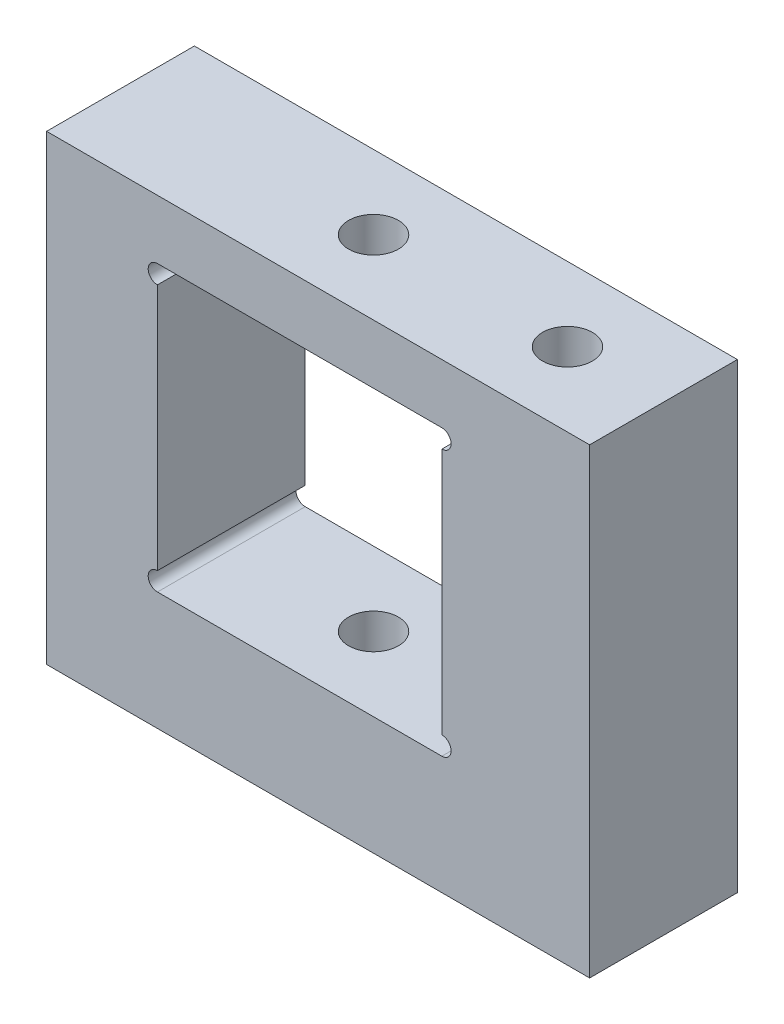
ISO-10303-21;
HEADER;
FILE_DESCRIPTION(('STEP AP214'),'2;1');
FILE_NAME('part.step','',(''),(''),'','','');
FILE_SCHEMA(('AUTOMOTIVE_DESIGN { 1 0 10303 214 1 1 1 1 }'));
ENDSEC;
DATA;
#1=APPLICATION_CONTEXT('core data for automotive mechanical design processes');
#2=APPLICATION_PROTOCOL_DEFINITION('international standard','automotive_design',2000,#1);
#3=PRODUCT_CONTEXT('',#1,'mechanical');
#4=PRODUCT('Part','Part','',(#3));
#5=PRODUCT_RELATED_PRODUCT_CATEGORY('part','',(#4));
#6=PRODUCT_DEFINITION_FORMATION('','',#4);
#7=PRODUCT_DEFINITION_CONTEXT('part definition',#1,'design');
#8=PRODUCT_DEFINITION('design','',#6,#7);
#9=PRODUCT_DEFINITION_SHAPE('','',#8);
#10=(LENGTH_UNIT() NAMED_UNIT(*) SI_UNIT(.MILLI.,.METRE.));
#11=(NAMED_UNIT(*) PLANE_ANGLE_UNIT() SI_UNIT($,.RADIAN.));
#12=(NAMED_UNIT(*) SI_UNIT($,.STERADIAN.) SOLID_ANGLE_UNIT());
#13=UNCERTAINTY_MEASURE_WITH_UNIT(LENGTH_MEASURE(1.E-05),#10,'distance_accuracy_value','');
#14=(GEOMETRIC_REPRESENTATION_CONTEXT(3) GLOBAL_UNCERTAINTY_ASSIGNED_CONTEXT((#13)) GLOBAL_UNIT_ASSIGNED_CONTEXT((#10,
#11,#12)) REPRESENTATION_CONTEXT('',''));
#15=CARTESIAN_POINT('',(0.,0.,0.));
#16=DIRECTION('',(0.,0.,1.));
#17=DIRECTION('',(1.,0.,0.));
#18=AXIS2_PLACEMENT_3D('',#15,#16,#17);
#19=CARTESIAN_POINT('',(-13.7,0.,8.));
#20=DIRECTION('',(-1.,0.,0.));
#21=DIRECTION('',(0.,0.,1.));
#22=AXIS2_PLACEMENT_3D('',#19,#20,#21);
#23=PLANE('',#22);
#24=DIRECTION('',(0.,1.,0.));
#25=VECTOR('',#24,1.);
#26=CARTESIAN_POINT('',(-13.7,0.,0.));
#27=LINE('',#26,#25);
#28=CARTESIAN_POINT('',(-13.7,-14.1,0.));
#29=VERTEX_POINT('',#28);
#30=CARTESIAN_POINT('',(-13.7,10.9,0.));
#31=VERTEX_POINT('',#30);
#32=EDGE_CURVE('E183',#29,#31,#27,.T.);
#33=ORIENTED_EDGE('',*,*,#32,.F.);
#34=DIRECTION('',(0.,0.,-1.));
#35=VECTOR('',#34,1.);
#36=CARTESIAN_POINT('',(-13.7,-14.1,8.));
#37=LINE('',#36,#35);
#38=CARTESIAN_POINT('',(-13.7,-14.1,8.));
#39=VERTEX_POINT('',#38);
#40=EDGE_CURVE('E11',#39,#29,#37,.T.);
#41=ORIENTED_EDGE('',*,*,#40,.F.);
#42=DIRECTION('',(0.,1.,0.));
#43=VECTOR('',#42,1.);
#44=CARTESIAN_POINT('',(-13.7,0.,8.));
#45=LINE('',#44,#43);
#46=CARTESIAN_POINT('',(-13.7,10.9,8.));
#47=VERTEX_POINT('',#46);
#48=EDGE_CURVE('E149',#39,#47,#45,.T.);
#49=ORIENTED_EDGE('',*,*,#48,.T.);
#50=DIRECTION('',(0.,0.,-1.));
#51=VECTOR('',#50,1.);
#52=CARTESIAN_POINT('',(-13.7,10.9,8.));
#53=LINE('',#52,#51);
#54=EDGE_CURVE('E56',#47,#31,#53,.T.);
#55=ORIENTED_EDGE('',*,*,#54,.T.);
#56=EDGE_LOOP('',(#33,#41,#49,#55));
#57=FACE_BOUND('',#56,.T.);
#58=ADVANCED_FACE('F37',(#57),#23,.T.);
#59=CARTESIAN_POINT('',(0.,-14.1,8.));
#60=DIRECTION('',(0.,-1.,0.));
#61=DIRECTION('',(1.,0.,0.));
#62=AXIS2_PLACEMENT_3D('',#59,#60,#61);
#63=PLANE('',#62);
#64=CARTESIAN_POINT('',(0.,-14.1,4.));
#65=DIRECTION('',(0.,1.,0.));
#66=DIRECTION('',(0.,0.,1.));
#67=AXIS2_PLACEMENT_3D('',#64,#65,#66);
#68=CIRCLE('',#67,1.35);
#69=CARTESIAN_POINT('',(0.,-14.1,5.35));
#70=VERTEX_POINT('',#69);
#71=EDGE_CURVE('E215',#70,#70,#68,.T.);
#72=ORIENTED_EDGE('',*,*,#71,.T.);
#73=EDGE_LOOP('',(#72));
#74=FACE_BOUND('',#73,.T.);
#75=CARTESIAN_POINT('',(10.5,-14.1,4.));
#76=DIRECTION('',(0.,1.,0.));
#77=DIRECTION('',(0.,0.,1.));
#78=AXIS2_PLACEMENT_3D('',#75,#76,#77);
#79=CIRCLE('',#78,1.35);
#80=CARTESIAN_POINT('',(10.5,-14.1,5.35));
#81=VERTEX_POINT('',#80);
#82=EDGE_CURVE('E209',#81,#81,#79,.T.);
#83=ORIENTED_EDGE('',*,*,#82,.T.);
#84=EDGE_LOOP('',(#83));
#85=FACE_BOUND('',#84,.T.);
#86=DIRECTION('',(-1.,0.,0.));
#87=VECTOR('',#86,1.);
#88=CARTESIAN_POINT('',(0.,-14.1,0.));
#89=LINE('',#88,#87);
#90=CARTESIAN_POINT('',(15.7,-14.1,0.));
#91=VERTEX_POINT('',#90);
#92=EDGE_CURVE('E138',#91,#29,#89,.T.);
#93=ORIENTED_EDGE('',*,*,#92,.F.);
#94=DIRECTION('',(0.,0.,-1.));
#95=VECTOR('',#94,1.);
#96=CARTESIAN_POINT('',(15.7,-14.1,8.));
#97=LINE('',#96,#95);
#98=CARTESIAN_POINT('',(15.7,-14.1,8.));
#99=VERTEX_POINT('',#98);
#100=EDGE_CURVE('E47',#99,#91,#97,.T.);
#101=ORIENTED_EDGE('',*,*,#100,.F.);
#102=DIRECTION('',(-1.,0.,0.));
#103=VECTOR('',#102,1.);
#104=CARTESIAN_POINT('',(0.,-14.1,8.));
#105=LINE('',#104,#103);
#106=EDGE_CURVE('E136',#99,#39,#105,.T.);
#107=ORIENTED_EDGE('',*,*,#106,.T.);
#108=ORIENTED_EDGE('',*,*,#40,.T.);
#109=EDGE_LOOP('',(#93,#101,#107,#108));
#110=FACE_BOUND('',#109,.T.);
#111=ADVANCED_FACE('F135',(#74,#85,#110),#63,.T.);
#112=CARTESIAN_POINT('',(15.7,0.,8.));
#113=DIRECTION('',(1.,0.,0.));
#114=DIRECTION('',(0.,1.,0.));
#115=AXIS2_PLACEMENT_3D('',#112,#113,#114);
#116=PLANE('',#115);
#117=DIRECTION('',(0.,-1.,0.));
#118=VECTOR('',#117,1.);
#119=CARTESIAN_POINT('',(15.7,0.,0.));
#120=LINE('',#119,#118);
#121=CARTESIAN_POINT('',(15.7,10.9,0.));
#122=VERTEX_POINT('',#121);
#123=EDGE_CURVE('E186',#122,#91,#120,.T.);
#124=ORIENTED_EDGE('',*,*,#123,.F.);
#125=DIRECTION('',(0.,0.,-1.));
#126=VECTOR('',#125,1.);
#127=CARTESIAN_POINT('',(15.7,10.9,8.));
#128=LINE('',#127,#126);
#129=CARTESIAN_POINT('',(15.7,10.9,8.));
#130=VERTEX_POINT('',#129);
#131=EDGE_CURVE('E93',#130,#122,#128,.T.);
#132=ORIENTED_EDGE('',*,*,#131,.F.);
#133=DIRECTION('',(0.,-1.,0.));
#134=VECTOR('',#133,1.);
#135=CARTESIAN_POINT('',(15.7,0.,8.));
#136=LINE('',#135,#134);
#137=EDGE_CURVE('E148',#130,#99,#136,.T.);
#138=ORIENTED_EDGE('',*,*,#137,.T.);
#139=ORIENTED_EDGE('',*,*,#100,.T.);
#140=EDGE_LOOP('',(#124,#132,#138,#139));
#141=FACE_BOUND('',#140,.T.);
#142=ADVANCED_FACE('F151',(#141),#116,.T.);
#143=CARTESIAN_POINT('',(-7.7,-7.2,8.));
#144=DIRECTION('',(0.,0.,-1.));
#145=DIRECTION('',(-1.,0.,0.));
#146=AXIS2_PLACEMENT_3D('',#143,#144,#145);
#147=CYLINDRICAL_SURFACE('',#146,0.5);
#148=CARTESIAN_POINT('',(-7.7,-7.2,0.));
#149=DIRECTION('',(0.,0.,1.));
#150=DIRECTION('',(1.,0.,0.));
#151=AXIS2_PLACEMENT_3D('',#148,#149,#150);
#152=CIRCLE('',#151,0.5);
#153=CARTESIAN_POINT('',(-7.7,-6.7,0.));
#154=VERTEX_POINT('',#153);
#155=CARTESIAN_POINT('',(-7.7,-7.7,0.));
#156=VERTEX_POINT('',#155);
#157=EDGE_CURVE('E158',#154,#156,#152,.T.);
#158=ORIENTED_EDGE('',*,*,#157,.F.);
#159=DIRECTION('',(0.,0.,-1.));
#160=VECTOR('',#159,1.);
#161=CARTESIAN_POINT('',(-7.7,-6.7,8.));
#162=LINE('',#161,#160);
#163=CARTESIAN_POINT('',(-7.7,-6.7,8.));
#164=VERTEX_POINT('',#163);
#165=EDGE_CURVE('E105',#164,#154,#162,.T.);
#166=ORIENTED_EDGE('',*,*,#165,.F.);
#167=CARTESIAN_POINT('',(-7.7,-7.2,8.));
#168=DIRECTION('',(0.,0.,1.));
#169=DIRECTION('',(1.,0.,0.));
#170=AXIS2_PLACEMENT_3D('',#167,#168,#169);
#171=CIRCLE('',#170,0.5);
#172=CARTESIAN_POINT('',(-7.7,-7.7,8.));
#173=VERTEX_POINT('',#172);
#174=EDGE_CURVE('E191',#164,#173,#171,.T.);
#175=ORIENTED_EDGE('',*,*,#174,.T.);
#176=DIRECTION('',(0.,0.,-1.));
#177=VECTOR('',#176,1.);
#178=CARTESIAN_POINT('',(-7.7,-7.7,8.));
#179=LINE('',#178,#177);
#180=EDGE_CURVE('E154',#173,#156,#179,.T.);
#181=ORIENTED_EDGE('',*,*,#180,.T.);
#182=EDGE_LOOP('',(#158,#166,#175,#181));
#183=FACE_BOUND('',#182,.T.);
#184=ADVANCED_FACE('F39',(#183),#147,.F.);
#185=CARTESIAN_POINT('',(-7.7,0.,8.));
#186=DIRECTION('',(-1.,0.,0.));
#187=DIRECTION('',(0.,-1.,0.));
#188=AXIS2_PLACEMENT_3D('',#185,#186,#187);
#189=PLANE('',#188);
#190=DIRECTION('',(0.,1.,0.));
#191=VECTOR('',#190,1.);
#192=CARTESIAN_POINT('',(-7.7,0.,0.));
#193=LINE('',#192,#191);
#194=CARTESIAN_POINT('',(-7.7,6.7,0.));
#195=VERTEX_POINT('',#194);
#196=EDGE_CURVE('E161',#154,#195,#193,.T.);
#197=ORIENTED_EDGE('',*,*,#196,.T.);
#198=DIRECTION('',(0.,0.,-1.));
#199=VECTOR('',#198,1.);
#200=CARTESIAN_POINT('',(-7.7,6.7,8.));
#201=LINE('',#200,#199);
#202=CARTESIAN_POINT('',(-7.7,6.7,8.));
#203=VERTEX_POINT('',#202);
#204=EDGE_CURVE('E205',#203,#195,#201,.T.);
#205=ORIENTED_EDGE('',*,*,#204,.F.);
#206=DIRECTION('',(0.,1.,0.));
#207=VECTOR('',#206,1.);
#208=CARTESIAN_POINT('',(-7.7,0.,8.));
#209=LINE('',#208,#207);
#210=EDGE_CURVE('E227',#164,#203,#209,.T.);
#211=ORIENTED_EDGE('',*,*,#210,.F.);
#212=ORIENTED_EDGE('',*,*,#165,.T.);
#213=EDGE_LOOP('',(#197,#205,#211,#212));
#214=FACE_BOUND('',#213,.T.);
#215=ADVANCED_FACE('F289',(#214),#189,.F.);
#216=CARTESIAN_POINT('',(-7.7,7.2,8.));
#217=DIRECTION('',(0.,0.,-1.));
#218=DIRECTION('',(-1.,0.,0.));
#219=AXIS2_PLACEMENT_3D('',#216,#217,#218);
#220=CYLINDRICAL_SURFACE('',#219,0.5);
#221=CARTESIAN_POINT('',(-7.7,7.2,0.));
#222=DIRECTION('',(0.,0.,1.));
#223=DIRECTION('',(1.,0.,0.));
#224=AXIS2_PLACEMENT_3D('',#221,#222,#223);
#225=CIRCLE('',#224,0.5);
#226=CARTESIAN_POINT('',(-7.7,7.7,0.));
#227=VERTEX_POINT('',#226);
#228=EDGE_CURVE('E165',#227,#195,#225,.T.);
#229=ORIENTED_EDGE('',*,*,#228,.F.);
#230=DIRECTION('',(0.,0.,-1.));
#231=VECTOR('',#230,1.);
#232=CARTESIAN_POINT('',(-7.7,7.7,8.));
#233=LINE('',#232,#231);
#234=CARTESIAN_POINT('',(-7.7,7.7,8.));
#235=VERTEX_POINT('',#234);
#236=EDGE_CURVE('E203',#235,#227,#233,.T.);
#237=ORIENTED_EDGE('',*,*,#236,.F.);
#238=CARTESIAN_POINT('',(-7.7,7.2,8.));
#239=DIRECTION('',(0.,0.,1.));
#240=DIRECTION('',(1.,0.,0.));
#241=AXIS2_PLACEMENT_3D('',#238,#239,#240);
#242=CIRCLE('',#241,0.5);
#243=EDGE_CURVE('E229',#235,#203,#242,.T.);
#244=ORIENTED_EDGE('',*,*,#243,.T.);
#245=ORIENTED_EDGE('',*,*,#204,.T.);
#246=EDGE_LOOP('',(#229,#237,#244,#245));
#247=FACE_BOUND('',#246,.T.);
#248=ADVANCED_FACE('F286',(#247),#220,.F.);
#249=CARTESIAN_POINT('',(0.,7.7,8.));
#250=DIRECTION('',(0.,-1.,0.));
#251=DIRECTION('',(1.,0.,0.));
#252=AXIS2_PLACEMENT_3D('',#249,#250,#251);
#253=PLANE('',#252);
#254=CARTESIAN_POINT('',(0.,7.7,4.));
#255=DIRECTION('',(0.,-1.,0.));
#256=DIRECTION('',(1.,0.,0.));
#257=AXIS2_PLACEMENT_3D('',#254,#255,#256);
#258=CIRCLE('',#257,1.35);
#259=CARTESIAN_POINT('',(1.35,7.7,4.));
#260=VERTEX_POINT('',#259);
#261=EDGE_CURVE('E162',#260,#260,#258,.T.);
#262=ORIENTED_EDGE('',*,*,#261,.F.);
#263=EDGE_LOOP('',(#262));
#264=FACE_BOUND('',#263,.T.);
#265=DIRECTION('',(-1.,0.,0.));
#266=VECTOR('',#265,1.);
#267=CARTESIAN_POINT('',(0.,7.7,0.));
#268=LINE('',#267,#266);
#269=CARTESIAN_POINT('',(7.7,7.7,0.));
#270=VERTEX_POINT('',#269);
#271=EDGE_CURVE('E168',#270,#227,#268,.T.);
#272=ORIENTED_EDGE('',*,*,#271,.F.);
#273=DIRECTION('',(0.,0.,-1.));
#274=VECTOR('',#273,1.);
#275=CARTESIAN_POINT('',(7.7,7.7,8.));
#276=LINE('',#275,#274);
#277=CARTESIAN_POINT('',(7.7,7.7,8.));
#278=VERTEX_POINT('',#277);
#279=EDGE_CURVE('E201',#278,#270,#276,.T.);
#280=ORIENTED_EDGE('',*,*,#279,.F.);
#281=DIRECTION('',(-1.,0.,0.));
#282=VECTOR('',#281,1.);
#283=CARTESIAN_POINT('',(0.,7.7,8.));
#284=LINE('',#283,#282);
#285=EDGE_CURVE('E232',#278,#235,#284,.T.);
#286=ORIENTED_EDGE('',*,*,#285,.T.);
#287=ORIENTED_EDGE('',*,*,#236,.T.);
#288=EDGE_LOOP('',(#272,#280,#286,#287));
#289=FACE_BOUND('',#288,.T.);
#290=ADVANCED_FACE('F282',(#264,#289),#253,.T.);
#291=CARTESIAN_POINT('',(7.7,7.2,8.));
#292=DIRECTION('',(0.,0.,-1.));
#293=DIRECTION('',(-1.,0.,0.));
#294=AXIS2_PLACEMENT_3D('',#291,#292,#293);
#295=CYLINDRICAL_SURFACE('',#294,0.5);
#296=CARTESIAN_POINT('',(7.7,7.2,0.));
#297=DIRECTION('',(0.,0.,1.));
#298=DIRECTION('',(1.,0.,0.));
#299=AXIS2_PLACEMENT_3D('',#296,#297,#298);
#300=CIRCLE('',#299,0.5);
#301=CARTESIAN_POINT('',(7.7,6.7,0.));
#302=VERTEX_POINT('',#301);
#303=EDGE_CURVE('E171',#302,#270,#300,.T.);
#304=ORIENTED_EDGE('',*,*,#303,.F.);
#305=DIRECTION('',(0.,0.,-1.));
#306=VECTOR('',#305,1.);
#307=CARTESIAN_POINT('',(7.7,6.7,8.));
#308=LINE('',#307,#306);
#309=CARTESIAN_POINT('',(7.7,6.7,8.));
#310=VERTEX_POINT('',#309);
#311=EDGE_CURVE('E199',#310,#302,#308,.T.);
#312=ORIENTED_EDGE('',*,*,#311,.F.);
#313=CARTESIAN_POINT('',(7.7,7.2,8.));
#314=DIRECTION('',(0.,0.,1.));
#315=DIRECTION('',(1.,0.,0.));
#316=AXIS2_PLACEMENT_3D('',#313,#314,#315);
#317=CIRCLE('',#316,0.5);
#318=EDGE_CURVE('E235',#310,#278,#317,.T.);
#319=ORIENTED_EDGE('',*,*,#318,.T.);
#320=ORIENTED_EDGE('',*,*,#279,.T.);
#321=EDGE_LOOP('',(#304,#312,#319,#320));
#322=FACE_BOUND('',#321,.T.);
#323=ADVANCED_FACE('F278',(#322),#295,.F.);
#324=CARTESIAN_POINT('',(7.7,0.,8.));
#325=DIRECTION('',(-1.,0.,0.));
#326=DIRECTION('',(0.,0.,1.));
#327=AXIS2_PLACEMENT_3D('',#324,#325,#326);
#328=PLANE('',#327);
#329=DIRECTION('',(0.,1.,0.));
#330=VECTOR('',#329,1.);
#331=CARTESIAN_POINT('',(7.7,0.,0.));
#332=LINE('',#331,#330);
#333=CARTESIAN_POINT('',(7.7,-6.7,0.));
#334=VERTEX_POINT('',#333);
#335=EDGE_CURVE('E174',#334,#302,#332,.T.);
#336=ORIENTED_EDGE('',*,*,#335,.F.);
#337=DIRECTION('',(0.,0.,-1.));
#338=VECTOR('',#337,1.);
#339=CARTESIAN_POINT('',(7.7,-6.7,8.));
#340=LINE('',#339,#338);
#341=CARTESIAN_POINT('',(7.7,-6.7,8.));
#342=VERTEX_POINT('',#341);
#343=EDGE_CURVE('E197',#342,#334,#340,.T.);
#344=ORIENTED_EDGE('',*,*,#343,.F.);
#345=DIRECTION('',(0.,1.,0.));
#346=VECTOR('',#345,1.);
#347=CARTESIAN_POINT('',(7.7,0.,8.));
#348=LINE('',#347,#346);
#349=EDGE_CURVE('E238',#342,#310,#348,.T.);
#350=ORIENTED_EDGE('',*,*,#349,.T.);
#351=ORIENTED_EDGE('',*,*,#311,.T.);
#352=EDGE_LOOP('',(#336,#344,#350,#351));
#353=FACE_BOUND('',#352,.T.);
#354=ADVANCED_FACE('F274',(#353),#328,.T.);
#355=CARTESIAN_POINT('',(7.7,-7.2,8.));
#356=DIRECTION('',(0.,0.,-1.));
#357=DIRECTION('',(-1.,0.,0.));
#358=AXIS2_PLACEMENT_3D('',#355,#356,#357);
#359=CYLINDRICAL_SURFACE('',#358,0.5);
#360=CARTESIAN_POINT('',(7.7,-7.2,0.));
#361=DIRECTION('',(0.,0.,1.));
#362=DIRECTION('',(1.,0.,0.));
#363=AXIS2_PLACEMENT_3D('',#360,#361,#362);
#364=CIRCLE('',#363,0.5);
#365=CARTESIAN_POINT('',(7.7,-7.7,0.));
#366=VERTEX_POINT('',#365);
#367=EDGE_CURVE('E177',#366,#334,#364,.T.);
#368=ORIENTED_EDGE('',*,*,#367,.F.);
#369=DIRECTION('',(0.,0.,-1.));
#370=VECTOR('',#369,1.);
#371=CARTESIAN_POINT('',(7.7,-7.7,8.));
#372=LINE('',#371,#370);
#373=CARTESIAN_POINT('',(7.7,-7.7,8.));
#374=VERTEX_POINT('',#373);
#375=EDGE_CURVE('E195',#374,#366,#372,.T.);
#376=ORIENTED_EDGE('',*,*,#375,.F.);
#377=CARTESIAN_POINT('',(7.7,-7.2,8.));
#378=DIRECTION('',(0.,0.,1.));
#379=DIRECTION('',(1.,0.,0.));
#380=AXIS2_PLACEMENT_3D('',#377,#378,#379);
#381=CIRCLE('',#380,0.5);
#382=EDGE_CURVE('E241',#374,#342,#381,.T.);
#383=ORIENTED_EDGE('',*,*,#382,.T.);
#384=ORIENTED_EDGE('',*,*,#343,.T.);
#385=EDGE_LOOP('',(#368,#376,#383,#384));
#386=FACE_BOUND('',#385,.T.);
#387=ADVANCED_FACE('F257',(#386),#359,.F.);
#388=CARTESIAN_POINT('',(0.,-7.7,8.));
#389=DIRECTION('',(0.,-1.,0.));
#390=DIRECTION('',(1.,0.,0.));
#391=AXIS2_PLACEMENT_3D('',#388,#389,#390);
#392=PLANE('',#391);
#393=CARTESIAN_POINT('',(0.,-7.7,4.));
#394=DIRECTION('',(0.,-1.,0.));
#395=DIRECTION('',(1.,0.,0.));
#396=AXIS2_PLACEMENT_3D('',#393,#394,#395);
#397=CIRCLE('',#396,1.35);
#398=CARTESIAN_POINT('',(1.35,-7.7,4.));
#399=VERTEX_POINT('',#398);
#400=EDGE_CURVE('E213',#399,#399,#397,.T.);
#401=ORIENTED_EDGE('',*,*,#400,.T.);
#402=EDGE_LOOP('',(#401));
#403=FACE_BOUND('',#402,.T.);
#404=DIRECTION('',(-1.,0.,0.));
#405=VECTOR('',#404,1.);
#406=CARTESIAN_POINT('',(0.,-7.7,0.));
#407=LINE('',#406,#405);
#408=EDGE_CURVE('E180',#366,#156,#407,.T.);
#409=ORIENTED_EDGE('',*,*,#408,.T.);
#410=ORIENTED_EDGE('',*,*,#180,.F.);
#411=DIRECTION('',(-1.,0.,0.));
#412=VECTOR('',#411,1.);
#413=CARTESIAN_POINT('',(0.,-7.7,8.));
#414=LINE('',#413,#412);
#415=EDGE_CURVE('E244',#374,#173,#414,.T.);
#416=ORIENTED_EDGE('',*,*,#415,.F.);
#417=ORIENTED_EDGE('',*,*,#375,.T.);
#418=EDGE_LOOP('',(#409,#410,#416,#417));
#419=FACE_BOUND('',#418,.T.);
#420=ADVANCED_FACE('F247',(#403,#419),#392,.F.);
#421=CARTESIAN_POINT('',(0.,10.9,8.));
#422=DIRECTION('',(0.,1.,0.));
#423=DIRECTION('',(0.,0.,1.));
#424=AXIS2_PLACEMENT_3D('',#421,#422,#423);
#425=PLANE('',#424);
#426=CARTESIAN_POINT('',(0.,10.9,4.));
#427=DIRECTION('',(0.,1.,0.));
#428=DIRECTION('',(0.,0.,1.));
#429=AXIS2_PLACEMENT_3D('',#426,#427,#428);
#430=CIRCLE('',#429,1.35);
#431=CARTESIAN_POINT('',(0.,10.9,5.35));
#432=VERTEX_POINT('',#431);
#433=EDGE_CURVE('E41',#432,#432,#430,.T.);
#434=ORIENTED_EDGE('',*,*,#433,.F.);
#435=EDGE_LOOP('',(#434));
#436=FACE_BOUND('',#435,.T.);
#437=CARTESIAN_POINT('',(10.5,10.9,4.));
#438=DIRECTION('',(0.,1.,0.));
#439=DIRECTION('',(0.,0.,1.));
#440=AXIS2_PLACEMENT_3D('',#437,#438,#439);
#441=CIRCLE('',#440,1.35);
#442=CARTESIAN_POINT('',(10.5,10.9,5.35));
#443=VERTEX_POINT('',#442);
#444=EDGE_CURVE('E207',#443,#443,#441,.T.);
#445=ORIENTED_EDGE('',*,*,#444,.F.);
#446=EDGE_LOOP('',(#445));
#447=FACE_BOUND('',#446,.T.);
#448=DIRECTION('',(1.,0.,0.));
#449=VECTOR('',#448,1.);
#450=CARTESIAN_POINT('',(0.,10.9,0.));
#451=LINE('',#450,#449);
#452=EDGE_CURVE('E188',#31,#122,#451,.T.);
#453=ORIENTED_EDGE('',*,*,#452,.F.);
#454=ORIENTED_EDGE('',*,*,#54,.F.);
#455=DIRECTION('',(1.,0.,0.));
#456=VECTOR('',#455,1.);
#457=CARTESIAN_POINT('',(0.,10.9,8.));
#458=LINE('',#457,#456);
#459=EDGE_CURVE('E152',#47,#130,#458,.T.);
#460=ORIENTED_EDGE('',*,*,#459,.T.);
#461=ORIENTED_EDGE('',*,*,#131,.T.);
#462=EDGE_LOOP('',(#453,#454,#460,#461));
#463=FACE_BOUND('',#462,.T.);
#464=ADVANCED_FACE('F245',(#436,#447,#463),#425,.T.);
#465=CARTESIAN_POINT('',(0.,0.,8.));
#466=DIRECTION('',(0.,0.,1.));
#467=DIRECTION('',(1.,0.,0.));
#468=AXIS2_PLACEMENT_3D('',#465,#466,#467);
#469=PLANE('',#468);
#470=ORIENTED_EDGE('',*,*,#174,.F.);
#471=ORIENTED_EDGE('',*,*,#210,.T.);
#472=ORIENTED_EDGE('',*,*,#243,.F.);
#473=ORIENTED_EDGE('',*,*,#285,.F.);
#474=ORIENTED_EDGE('',*,*,#318,.F.);
#475=ORIENTED_EDGE('',*,*,#349,.F.);
#476=ORIENTED_EDGE('',*,*,#382,.F.);
#477=ORIENTED_EDGE('',*,*,#415,.T.);
#478=EDGE_LOOP('',(#470,#471,#472,#473,#474,#475,#476,#477));
#479=FACE_BOUND('',#478,.T.);
#480=ORIENTED_EDGE('',*,*,#48,.F.);
#481=ORIENTED_EDGE('',*,*,#106,.F.);
#482=ORIENTED_EDGE('',*,*,#137,.F.);
#483=ORIENTED_EDGE('',*,*,#459,.F.);
#484=EDGE_LOOP('',(#480,#481,#482,#483));
#485=FACE_BOUND('',#484,.T.);
#486=ADVANCED_FACE('F146',(#479,#485),#469,.T.);
#487=CARTESIAN_POINT('',(0.,0.,0.));
#488=DIRECTION('',(0.,0.,1.));
#489=DIRECTION('',(1.,0.,0.));
#490=AXIS2_PLACEMENT_3D('',#487,#488,#489);
#491=PLANE('',#490);
#492=ORIENTED_EDGE('',*,*,#157,.T.);
#493=ORIENTED_EDGE('',*,*,#408,.F.);
#494=ORIENTED_EDGE('',*,*,#367,.T.);
#495=ORIENTED_EDGE('',*,*,#335,.T.);
#496=ORIENTED_EDGE('',*,*,#303,.T.);
#497=ORIENTED_EDGE('',*,*,#271,.T.);
#498=ORIENTED_EDGE('',*,*,#228,.T.);
#499=ORIENTED_EDGE('',*,*,#196,.F.);
#500=EDGE_LOOP('',(#492,#493,#494,#495,#496,#497,#498,#499));
#501=FACE_BOUND('',#500,.T.);
#502=ORIENTED_EDGE('',*,*,#32,.T.);
#503=ORIENTED_EDGE('',*,*,#452,.T.);
#504=ORIENTED_EDGE('',*,*,#123,.T.);
#505=ORIENTED_EDGE('',*,*,#92,.T.);
#506=EDGE_LOOP('',(#502,#503,#504,#505));
#507=FACE_BOUND('',#506,.T.);
#508=ADVANCED_FACE('F254',(#501,#507),#491,.F.);
#509=CARTESIAN_POINT('',(10.5,-14.1,4.));
#510=DIRECTION('',(0.,1.,0.));
#511=DIRECTION('',(0.,0.,1.));
#512=AXIS2_PLACEMENT_3D('',#509,#510,#511);
#513=CYLINDRICAL_SURFACE('',#512,1.35);
#514=ORIENTED_EDGE('',*,*,#444,.T.);
#515=EDGE_LOOP('',(#514));
#516=FACE_BOUND('',#515,.T.);
#517=ORIENTED_EDGE('',*,*,#82,.F.);
#518=EDGE_LOOP('',(#517));
#519=FACE_BOUND('',#518,.T.);
#520=ADVANCED_FACE('F317',(#516,#519),#513,.F.);
#521=CARTESIAN_POINT('',(0.,-14.1,4.));
#522=DIRECTION('',(0.,1.,0.));
#523=DIRECTION('',(0.,0.,1.));
#524=AXIS2_PLACEMENT_3D('',#521,#522,#523);
#525=CYLINDRICAL_SURFACE('',#524,1.35);
#526=ORIENTED_EDGE('',*,*,#261,.T.);
#527=EDGE_LOOP('',(#526));
#528=FACE_BOUND('',#527,.T.);
#529=ORIENTED_EDGE('',*,*,#433,.T.);
#530=EDGE_LOOP('',(#529));
#531=FACE_BOUND('',#530,.T.);
#532=ADVANCED_FACE('F321',(#528,#531),#525,.F.);
#533=ORIENTED_EDGE('',*,*,#71,.F.);
#534=EDGE_LOOP('',(#533));
#535=FACE_BOUND('',#534,.T.);
#536=ORIENTED_EDGE('',*,*,#400,.F.);
#537=EDGE_LOOP('',(#536));
#538=FACE_BOUND('',#537,.T.);
#539=ADVANCED_FACE('F325',(#535,#538),#525,.F.);
#540=CLOSED_SHELL('',(#58,#111,#142,#184,#215,#248,#290,#323,#354,#387,#420,#464,#486,#508,#520,
#532,#539));
#541=MANIFOLD_SOLID_BREP('B2',#540);
#542=ADVANCED_BREP_SHAPE_REPRESENTATION('',(#18,#541),#14);
#543=SHAPE_DEFINITION_REPRESENTATION(#9,#542);
ENDSEC;
END-ISO-10303-21;
